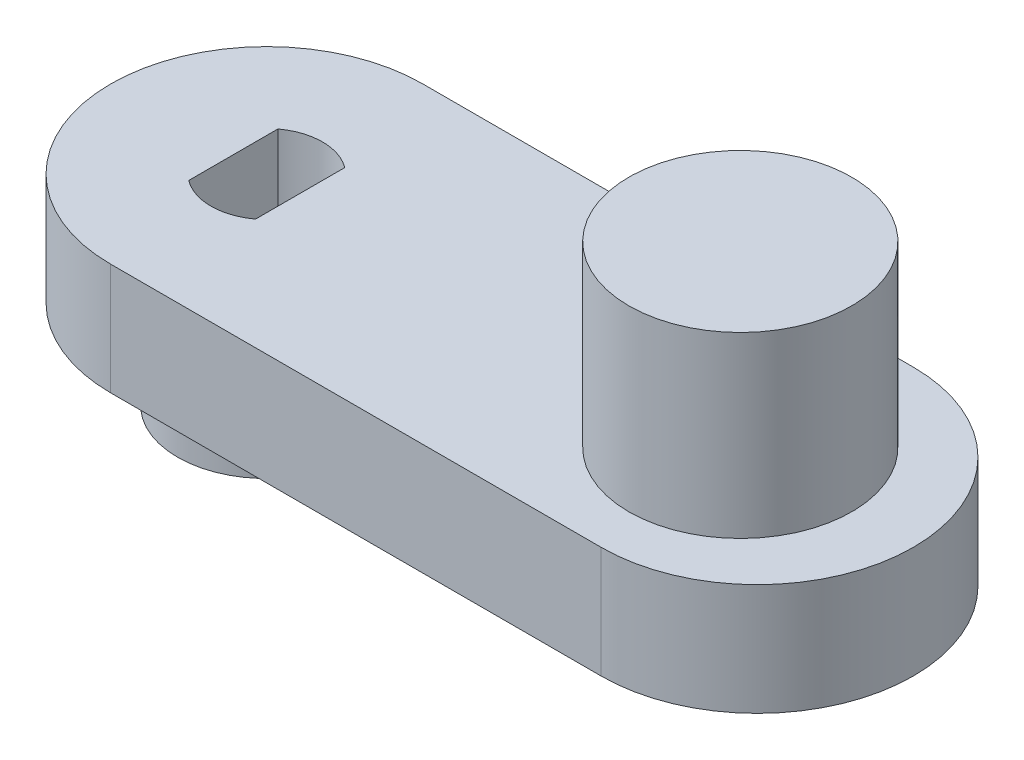
ISO-10303-21;
HEADER;
FILE_DESCRIPTION(('STEP AP214'),'2;1');
FILE_NAME('part.step','',(''),(''),'','','');
FILE_SCHEMA(('AUTOMOTIVE_DESIGN { 1 0 10303 214 1 1 1 1 }'));
ENDSEC;
DATA;
#1=APPLICATION_CONTEXT('core data for automotive mechanical design processes');
#2=APPLICATION_PROTOCOL_DEFINITION('international standard','automotive_design',2000,#1);
#3=PRODUCT_CONTEXT('',#1,'mechanical');
#4=PRODUCT('Part','Part','',(#3));
#5=PRODUCT_RELATED_PRODUCT_CATEGORY('part','',(#4));
#6=PRODUCT_DEFINITION_FORMATION('','',#4);
#7=PRODUCT_DEFINITION_CONTEXT('part definition',#1,'design');
#8=PRODUCT_DEFINITION('design','',#6,#7);
#9=PRODUCT_DEFINITION_SHAPE('','',#8);
#10=(LENGTH_UNIT() NAMED_UNIT(*) SI_UNIT(.MILLI.,.METRE.));
#11=(NAMED_UNIT(*) PLANE_ANGLE_UNIT() SI_UNIT($,.RADIAN.));
#12=(NAMED_UNIT(*) SI_UNIT($,.STERADIAN.) SOLID_ANGLE_UNIT());
#13=UNCERTAINTY_MEASURE_WITH_UNIT(LENGTH_MEASURE(1.E-05),#10,'distance_accuracy_value','');
#14=(GEOMETRIC_REPRESENTATION_CONTEXT(3) GLOBAL_UNCERTAINTY_ASSIGNED_CONTEXT((#13)) GLOBAL_UNIT_ASSIGNED_CONTEXT((#10,
#11,#12)) REPRESENTATION_CONTEXT('',''));
#15=CARTESIAN_POINT('',(0.,0.,0.));
#16=DIRECTION('',(0.,0.,1.));
#17=DIRECTION('',(1.,0.,0.));
#18=AXIS2_PLACEMENT_3D('',#15,#16,#17);
#19=CARTESIAN_POINT('',(0.,0.,0.));
#20=DIRECTION('',(0.,1.,0.));
#21=DIRECTION('',(0.,0.,1.));
#22=AXIS2_PLACEMENT_3D('',#19,#20,#21);
#23=PLANE('',#22);
#24=CARTESIAN_POINT('',(0.,0.,0.));
#25=DIRECTION('',(0.,1.,0.));
#26=DIRECTION('',(0.,0.,1.));
#27=AXIS2_PLACEMENT_3D('',#24,#25,#26);
#28=CIRCLE('',#27,7.);
#29=CARTESIAN_POINT('',(0.,0.,-7.));
#30=VERTEX_POINT('',#29);
#31=CARTESIAN_POINT('',(0.,0.,7.));
#32=VERTEX_POINT('',#31);
#33=EDGE_CURVE('E116',#30,#32,#28,.T.);
#34=ORIENTED_EDGE('',*,*,#33,.F.);
#35=DIRECTION('',(-1.,0.,0.));
#36=VECTOR('',#35,1.);
#37=CARTESIAN_POINT('',(0.,0.,-7.));
#38=LINE('',#37,#36);
#39=CARTESIAN_POINT('',(22.,0.,-7.));
#40=VERTEX_POINT('',#39);
#41=EDGE_CURVE('E78',#40,#30,#38,.T.);
#42=ORIENTED_EDGE('',*,*,#41,.F.);
#43=CARTESIAN_POINT('',(22.,0.,0.));
#44=DIRECTION('',(0.,1.,0.));
#45=DIRECTION('',(0.,0.,1.));
#46=AXIS2_PLACEMENT_3D('',#43,#44,#45);
#47=CIRCLE('',#46,7.);
#48=CARTESIAN_POINT('',(22.,0.,7.));
#49=VERTEX_POINT('',#48);
#50=EDGE_CURVE('E167',#49,#40,#47,.T.);
#51=ORIENTED_EDGE('',*,*,#50,.F.);
#52=DIRECTION('',(1.,0.,0.));
#53=VECTOR('',#52,1.);
#54=CARTESIAN_POINT('',(0.,0.,7.));
#55=LINE('',#54,#53);
#56=EDGE_CURVE('E165',#32,#49,#55,.T.);
#57=ORIENTED_EDGE('',*,*,#56,.F.);
#58=EDGE_LOOP('',(#34,#42,#51,#57));
#59=FACE_BOUND('',#58,.T.);
#60=CARTESIAN_POINT('',(0.,0.,0.));
#61=DIRECTION('',(0.,1.,0.));
#62=DIRECTION('',(0.,0.,1.));
#63=AXIS2_PLACEMENT_3D('',#60,#61,#62);
#64=CIRCLE('',#63,4.);
#65=CARTESIAN_POINT('',(0.,0.,4.));
#66=VERTEX_POINT('',#65);
#67=EDGE_CURVE('E11',#66,#66,#64,.F.);
#68=ORIENTED_EDGE('',*,*,#67,.F.);
#69=EDGE_LOOP('',(#68));
#70=FACE_BOUND('',#69,.T.);
#71=ADVANCED_FACE('F33',(#59,#70),#23,.F.);
#72=CARTESIAN_POINT('',(0.,5.,0.));
#73=DIRECTION('',(0.,-1.,0.));
#74=DIRECTION('',(0.,0.,-1.));
#75=AXIS2_PLACEMENT_3D('',#72,#73,#74);
#76=CYLINDRICAL_SURFACE('',#75,7.);
#77=ORIENTED_EDGE('',*,*,#33,.T.);
#78=DIRECTION('',(0.,-1.,0.));
#79=VECTOR('',#78,1.);
#80=CARTESIAN_POINT('',(0.,5.,7.));
#81=LINE('',#80,#79);
#82=CARTESIAN_POINT('',(0.,5.,7.));
#83=VERTEX_POINT('',#82);
#84=EDGE_CURVE('E41',#83,#32,#81,.T.);
#85=ORIENTED_EDGE('',*,*,#84,.F.);
#86=CARTESIAN_POINT('',(0.,5.,0.));
#87=DIRECTION('',(0.,1.,0.));
#88=DIRECTION('',(0.,0.,1.));
#89=AXIS2_PLACEMENT_3D('',#86,#87,#88);
#90=CIRCLE('',#89,7.);
#91=CARTESIAN_POINT('',(0.,5.,-7.));
#92=VERTEX_POINT('',#91);
#93=EDGE_CURVE('E156',#92,#83,#90,.T.);
#94=ORIENTED_EDGE('',*,*,#93,.F.);
#95=DIRECTION('',(0.,-1.,0.));
#96=VECTOR('',#95,1.);
#97=CARTESIAN_POINT('',(0.,5.,-7.));
#98=LINE('',#97,#96);
#99=EDGE_CURVE('E162',#92,#30,#98,.T.);
#100=ORIENTED_EDGE('',*,*,#99,.T.);
#101=EDGE_LOOP('',(#77,#85,#94,#100));
#102=FACE_BOUND('',#101,.T.);
#103=ADVANCED_FACE('F35',(#102),#76,.T.);
#104=CARTESIAN_POINT('',(0.,5.,7.));
#105=DIRECTION('',(0.,0.,-1.));
#106=DIRECTION('',(-1.,0.,0.));
#107=AXIS2_PLACEMENT_3D('',#104,#105,#106);
#108=PLANE('',#107);
#109=ORIENTED_EDGE('',*,*,#56,.T.);
#110=DIRECTION('',(0.,-1.,0.));
#111=VECTOR('',#110,1.);
#112=CARTESIAN_POINT('',(22.,5.,7.));
#113=LINE('',#112,#111);
#114=CARTESIAN_POINT('',(22.,5.,7.));
#115=VERTEX_POINT('',#114);
#116=EDGE_CURVE('E173',#115,#49,#113,.T.);
#117=ORIENTED_EDGE('',*,*,#116,.F.);
#118=DIRECTION('',(1.,0.,0.));
#119=VECTOR('',#118,1.);
#120=CARTESIAN_POINT('',(0.,5.,7.));
#121=LINE('',#120,#119);
#122=EDGE_CURVE('E86',#83,#115,#121,.T.);
#123=ORIENTED_EDGE('',*,*,#122,.F.);
#124=ORIENTED_EDGE('',*,*,#84,.T.);
#125=EDGE_LOOP('',(#109,#117,#123,#124));
#126=FACE_BOUND('',#125,.T.);
#127=ADVANCED_FACE('F176',(#126),#108,.F.);
#128=CARTESIAN_POINT('',(22.,5.,0.));
#129=DIRECTION('',(0.,-1.,0.));
#130=DIRECTION('',(0.,0.,-1.));
#131=AXIS2_PLACEMENT_3D('',#128,#129,#130);
#132=CYLINDRICAL_SURFACE('',#131,7.);
#133=ORIENTED_EDGE('',*,*,#50,.T.);
#134=DIRECTION('',(0.,-1.,0.));
#135=VECTOR('',#134,1.);
#136=CARTESIAN_POINT('',(22.,5.,-7.));
#137=LINE('',#136,#135);
#138=CARTESIAN_POINT('',(22.,5.,-7.));
#139=VERTEX_POINT('',#138);
#140=EDGE_CURVE('E171',#139,#40,#137,.T.);
#141=ORIENTED_EDGE('',*,*,#140,.F.);
#142=CARTESIAN_POINT('',(22.,5.,0.));
#143=DIRECTION('',(0.,1.,0.));
#144=DIRECTION('',(0.,0.,1.));
#145=AXIS2_PLACEMENT_3D('',#142,#143,#144);
#146=CIRCLE('',#145,7.);
#147=EDGE_CURVE('E159',#115,#139,#146,.T.);
#148=ORIENTED_EDGE('',*,*,#147,.F.);
#149=ORIENTED_EDGE('',*,*,#116,.T.);
#150=EDGE_LOOP('',(#133,#141,#148,#149));
#151=FACE_BOUND('',#150,.T.);
#152=ADVANCED_FACE('F185',(#151),#132,.T.);
#153=CARTESIAN_POINT('',(0.,5.,-7.));
#154=DIRECTION('',(0.,0.,1.));
#155=DIRECTION('',(1.,0.,0.));
#156=AXIS2_PLACEMENT_3D('',#153,#154,#155);
#157=PLANE('',#156);
#158=ORIENTED_EDGE('',*,*,#41,.T.);
#159=ORIENTED_EDGE('',*,*,#99,.F.);
#160=DIRECTION('',(-1.,0.,0.));
#161=VECTOR('',#160,1.);
#162=CARTESIAN_POINT('',(0.,5.,-7.));
#163=LINE('',#162,#161);
#164=EDGE_CURVE('E57',#139,#92,#163,.T.);
#165=ORIENTED_EDGE('',*,*,#164,.F.);
#166=ORIENTED_EDGE('',*,*,#140,.T.);
#167=EDGE_LOOP('',(#158,#159,#165,#166));
#168=FACE_BOUND('',#167,.T.);
#169=ADVANCED_FACE('F187',(#168),#157,.F.);
#170=CARTESIAN_POINT('',(0.,5.,0.));
#171=DIRECTION('',(0.,1.,0.));
#172=DIRECTION('',(0.,0.,1.));
#173=AXIS2_PLACEMENT_3D('',#170,#171,#172);
#174=PLANE('',#173);
#175=CARTESIAN_POINT('',(21.24,5.,0.));
#176=DIRECTION('',(0.,1.,0.));
#177=DIRECTION('',(0.,0.,1.));
#178=AXIS2_PLACEMENT_3D('',#175,#176,#177);
#179=CIRCLE('',#178,5.);
#180=CARTESIAN_POINT('',(21.24,5.,5.));
#181=VERTEX_POINT('',#180);
#182=EDGE_CURVE('E138',#181,#181,#179,.T.);
#183=ORIENTED_EDGE('',*,*,#182,.F.);
#184=EDGE_LOOP('',(#183));
#185=FACE_BOUND('',#184,.T.);
#186=CARTESIAN_POINT('',(0.,5.,0.));
#187=DIRECTION('',(0.,1.,0.));
#188=DIRECTION('',(0.,0.,1.));
#189=AXIS2_PLACEMENT_3D('',#186,#187,#188);
#190=CIRCLE('',#189,2.5);
#191=CARTESIAN_POINT('',(1.5,5.,-2.));
#192=VERTEX_POINT('',#191);
#193=CARTESIAN_POINT('',(-1.5,5.,-2.));
#194=VERTEX_POINT('',#193);
#195=EDGE_CURVE('E48',#192,#194,#190,.T.);
#196=ORIENTED_EDGE('',*,*,#195,.F.);
#197=DIRECTION('',(0.,0.,-1.));
#198=VECTOR('',#197,1.);
#199=CARTESIAN_POINT('',(1.5,5.,-2.));
#200=LINE('',#199,#198);
#201=CARTESIAN_POINT('',(1.5,5.,2.));
#202=VERTEX_POINT('',#201);
#203=EDGE_CURVE('E115',#202,#192,#200,.T.);
#204=ORIENTED_EDGE('',*,*,#203,.F.);
#205=CARTESIAN_POINT('',(0.,5.,0.));
#206=DIRECTION('',(0.,1.,0.));
#207=DIRECTION('',(0.,0.,1.));
#208=AXIS2_PLACEMENT_3D('',#205,#206,#207);
#209=CIRCLE('',#208,2.5);
#210=CARTESIAN_POINT('',(-1.5,5.,2.));
#211=VERTEX_POINT('',#210);
#212=EDGE_CURVE('E148',#211,#202,#209,.T.);
#213=ORIENTED_EDGE('',*,*,#212,.F.);
#214=DIRECTION('',(0.,0.,1.));
#215=VECTOR('',#214,1.);
#216=CARTESIAN_POINT('',(-1.5,5.,-2.));
#217=LINE('',#216,#215);
#218=EDGE_CURVE('E145',#194,#211,#217,.T.);
#219=ORIENTED_EDGE('',*,*,#218,.F.);
#220=EDGE_LOOP('',(#196,#204,#213,#219));
#221=FACE_BOUND('',#220,.T.);
#222=ORIENTED_EDGE('',*,*,#93,.T.);
#223=ORIENTED_EDGE('',*,*,#122,.T.);
#224=ORIENTED_EDGE('',*,*,#147,.T.);
#225=ORIENTED_EDGE('',*,*,#164,.T.);
#226=EDGE_LOOP('',(#222,#223,#224,#225));
#227=FACE_BOUND('',#226,.T.);
#228=ADVANCED_FACE('F188',(#185,#221,#227),#174,.T.);
#229=CARTESIAN_POINT('',(0.,-5.8309518948453,0.));
#230=DIRECTION('',(0.,1.,0.));
#231=DIRECTION('',(0.,0.,1.));
#232=AXIS2_PLACEMENT_3D('',#229,#230,#231);
#233=CYLINDRICAL_SURFACE('',#232,2.5);
#234=DIRECTION('',(0.,1.,0.));
#235=VECTOR('',#234,1.);
#236=CARTESIAN_POINT('',(-1.5,-5.8309518948453,-2.));
#237=LINE('',#236,#235);
#238=CARTESIAN_POINT('',(-1.5,-4.,-2.));
#239=VERTEX_POINT('',#238);
#240=EDGE_CURVE('E122',#239,#194,#237,.T.);
#241=ORIENTED_EDGE('',*,*,#240,.F.);
#242=CARTESIAN_POINT('',(0.,-4.,0.));
#243=DIRECTION('',(0.,-1.,0.));
#244=DIRECTION('',(0.,0.,-1.));
#245=AXIS2_PLACEMENT_3D('',#242,#243,#244);
#246=CIRCLE('',#245,2.5);
#247=CARTESIAN_POINT('',(1.5,-4.,-2.));
#248=VERTEX_POINT('',#247);
#249=EDGE_CURVE('E120',#239,#248,#246,.T.);
#250=ORIENTED_EDGE('',*,*,#249,.T.);
#251=DIRECTION('',(0.,1.,0.));
#252=VECTOR('',#251,1.);
#253=CARTESIAN_POINT('',(1.5,-5.8309518948453,-2.));
#254=LINE('',#253,#252);
#255=EDGE_CURVE('E108',#248,#192,#254,.T.);
#256=ORIENTED_EDGE('',*,*,#255,.T.);
#257=ORIENTED_EDGE('',*,*,#195,.T.);
#258=EDGE_LOOP('',(#241,#250,#256,#257));
#259=FACE_BOUND('',#258,.T.);
#260=ADVANCED_FACE('F121',(#259),#233,.F.);
#261=CARTESIAN_POINT('',(1.5,-5.8309518948453,-2.));
#262=DIRECTION('',(1.,0.,0.));
#263=DIRECTION('',(0.,0.,-1.));
#264=AXIS2_PLACEMENT_3D('',#261,#262,#263);
#265=PLANE('',#264);
#266=ORIENTED_EDGE('',*,*,#255,.F.);
#267=DIRECTION('',(0.,0.,1.));
#268=VECTOR('',#267,1.);
#269=CARTESIAN_POINT('',(1.5,-4.,-2.));
#270=LINE('',#269,#268);
#271=CARTESIAN_POINT('',(1.5,-4.,2.));
#272=VERTEX_POINT('',#271);
#273=EDGE_CURVE('E112',#248,#272,#270,.T.);
#274=ORIENTED_EDGE('',*,*,#273,.T.);
#275=DIRECTION('',(0.,1.,0.));
#276=VECTOR('',#275,1.);
#277=CARTESIAN_POINT('',(1.5,-5.8309518948453,2.));
#278=LINE('',#277,#276);
#279=EDGE_CURVE('E117',#272,#202,#278,.T.);
#280=ORIENTED_EDGE('',*,*,#279,.T.);
#281=ORIENTED_EDGE('',*,*,#203,.T.);
#282=EDGE_LOOP('',(#266,#274,#280,#281));
#283=FACE_BOUND('',#282,.T.);
#284=ADVANCED_FACE('F110',(#283),#265,.F.);
#285=CARTESIAN_POINT('',(0.,-5.8309518948453,0.));
#286=DIRECTION('',(0.,1.,0.));
#287=DIRECTION('',(0.,0.,1.));
#288=AXIS2_PLACEMENT_3D('',#285,#286,#287);
#289=CYLINDRICAL_SURFACE('',#288,2.5);
#290=ORIENTED_EDGE('',*,*,#279,.F.);
#291=CARTESIAN_POINT('',(0.,-4.,0.));
#292=DIRECTION('',(0.,-1.,0.));
#293=DIRECTION('',(0.,0.,-1.));
#294=AXIS2_PLACEMENT_3D('',#291,#292,#293);
#295=CIRCLE('',#294,2.5);
#296=CARTESIAN_POINT('',(-1.5,-4.,2.));
#297=VERTEX_POINT('',#296);
#298=EDGE_CURVE('E129',#272,#297,#295,.T.);
#299=ORIENTED_EDGE('',*,*,#298,.T.);
#300=DIRECTION('',(0.,1.,0.));
#301=VECTOR('',#300,1.);
#302=CARTESIAN_POINT('',(-1.5,-5.8309518948453,2.));
#303=LINE('',#302,#301);
#304=EDGE_CURVE('E153',#297,#211,#303,.T.);
#305=ORIENTED_EDGE('',*,*,#304,.T.);
#306=ORIENTED_EDGE('',*,*,#212,.T.);
#307=EDGE_LOOP('',(#290,#299,#305,#306));
#308=FACE_BOUND('',#307,.T.);
#309=ADVANCED_FACE('F263',(#308),#289,.F.);
#310=CARTESIAN_POINT('',(-1.5,-5.8309518948453,-2.));
#311=DIRECTION('',(-1.,0.,0.));
#312=DIRECTION('',(0.,0.,1.));
#313=AXIS2_PLACEMENT_3D('',#310,#311,#312);
#314=PLANE('',#313);
#315=ORIENTED_EDGE('',*,*,#304,.F.);
#316=DIRECTION('',(0.,0.,-1.));
#317=VECTOR('',#316,1.);
#318=CARTESIAN_POINT('',(-1.5,-4.,2.));
#319=LINE('',#318,#317);
#320=EDGE_CURVE('E131',#297,#239,#319,.T.);
#321=ORIENTED_EDGE('',*,*,#320,.T.);
#322=ORIENTED_EDGE('',*,*,#240,.T.);
#323=ORIENTED_EDGE('',*,*,#218,.T.);
#324=EDGE_LOOP('',(#315,#321,#322,#323));
#325=FACE_BOUND('',#324,.T.);
#326=ADVANCED_FACE('F237',(#325),#314,.F.);
#327=CARTESIAN_POINT('',(21.24,13.,0.));
#328=DIRECTION('',(0.,-1.,0.));
#329=DIRECTION('',(0.,0.,-1.));
#330=AXIS2_PLACEMENT_3D('',#327,#328,#329);
#331=CYLINDRICAL_SURFACE('',#330,5.);
#332=CARTESIAN_POINT('',(21.24,13.,0.));
#333=DIRECTION('',(0.,1.,0.));
#334=DIRECTION('',(0.,0.,1.));
#335=AXIS2_PLACEMENT_3D('',#332,#333,#334);
#336=CIRCLE('',#335,5.);
#337=CARTESIAN_POINT('',(21.24,13.,5.));
#338=VERTEX_POINT('',#337);
#339=EDGE_CURVE('E139',#338,#338,#336,.T.);
#340=ORIENTED_EDGE('',*,*,#339,.F.);
#341=EDGE_LOOP('',(#340));
#342=FACE_BOUND('',#341,.T.);
#343=ORIENTED_EDGE('',*,*,#182,.T.);
#344=EDGE_LOOP('',(#343));
#345=FACE_BOUND('',#344,.T.);
#346=ADVANCED_FACE('F233',(#342,#345),#331,.T.);
#347=CARTESIAN_POINT('',(21.24,13.,0.));
#348=DIRECTION('',(0.,1.,0.));
#349=DIRECTION('',(0.,0.,1.));
#350=AXIS2_PLACEMENT_3D('',#347,#348,#349);
#351=PLANE('',#350);
#352=ORIENTED_EDGE('',*,*,#339,.T.);
#353=EDGE_LOOP('',(#352));
#354=FACE_BOUND('',#353,.T.);
#355=ADVANCED_FACE('F236',(#354),#351,.T.);
#356=CARTESIAN_POINT('',(0.,-4.,0.));
#357=DIRECTION('',(0.,-1.,0.));
#358=DIRECTION('',(0.,0.,-1.));
#359=AXIS2_PLACEMENT_3D('',#356,#357,#358);
#360=PLANE('',#359);
#361=CARTESIAN_POINT('',(0.,-4.,0.));
#362=DIRECTION('',(0.,-1.,0.));
#363=DIRECTION('',(0.,0.,-1.));
#364=AXIS2_PLACEMENT_3D('',#361,#362,#363);
#365=CIRCLE('',#364,4.);
#366=CARTESIAN_POINT('',(0.,-4.,-4.));
#367=VERTEX_POINT('',#366);
#368=EDGE_CURVE('E135',#367,#367,#365,.T.);
#369=ORIENTED_EDGE('',*,*,#368,.T.);
#370=EDGE_LOOP('',(#369));
#371=FACE_BOUND('',#370,.T.);
#372=ORIENTED_EDGE('',*,*,#273,.F.);
#373=ORIENTED_EDGE('',*,*,#249,.F.);
#374=ORIENTED_EDGE('',*,*,#320,.F.);
#375=ORIENTED_EDGE('',*,*,#298,.F.);
#376=EDGE_LOOP('',(#372,#373,#374,#375));
#377=FACE_BOUND('',#376,.T.);
#378=ADVANCED_FACE('F127',(#371,#377),#360,.T.);
#379=CARTESIAN_POINT('',(0.,-4.,0.));
#380=DIRECTION('',(0.,1.,0.));
#381=DIRECTION('',(0.,0.,1.));
#382=AXIS2_PLACEMENT_3D('',#379,#380,#381);
#383=CYLINDRICAL_SURFACE('',#382,4.);
#384=ORIENTED_EDGE('',*,*,#368,.F.);
#385=EDGE_LOOP('',(#384));
#386=FACE_BOUND('',#385,.T.);
#387=ORIENTED_EDGE('',*,*,#67,.T.);
#388=EDGE_LOOP('',(#387));
#389=FACE_BOUND('',#388,.T.);
#390=ADVANCED_FACE('F284',(#386,#389),#383,.T.);
#391=CLOSED_SHELL('',(#71,#103,#127,#152,#169,#228,#260,#284,#309,#326,#346,#355,#378,#390));
#392=MANIFOLD_SOLID_BREP('B2',#391);
#393=ADVANCED_BREP_SHAPE_REPRESENTATION('',(#18,#392),#14);
#394=SHAPE_DEFINITION_REPRESENTATION(#9,#393);
ENDSEC;
END-ISO-10303-21;
